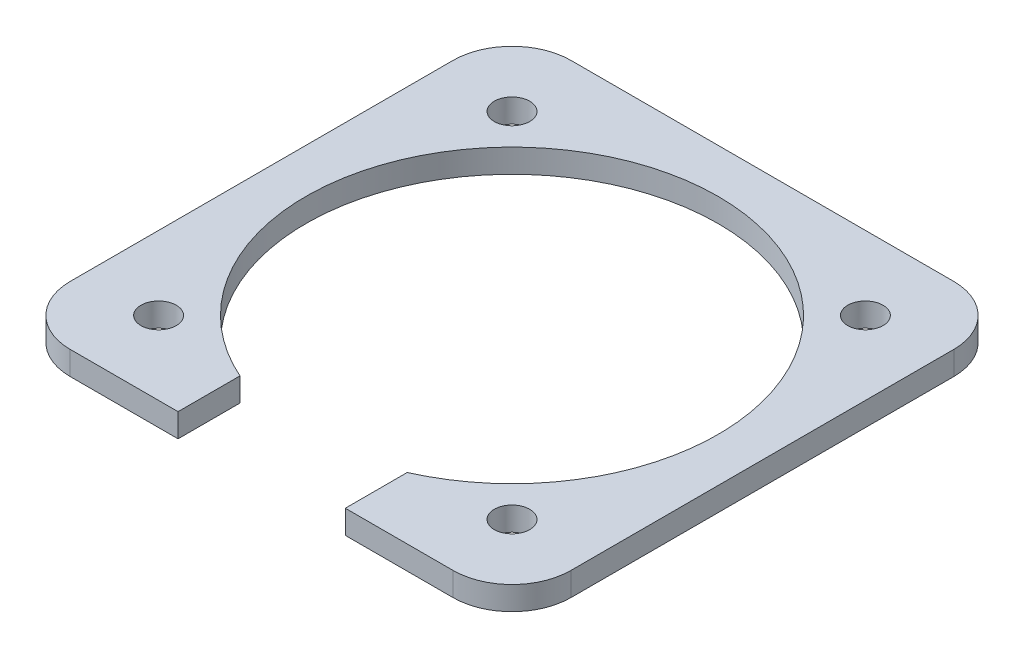
ISO-10303-21;
HEADER;
FILE_DESCRIPTION(('STEP AP214'),'2;1');
FILE_NAME('part.step','',(''),(''),'','','');
FILE_SCHEMA(('AUTOMOTIVE_DESIGN { 1 0 10303 214 1 1 1 1 }'));
ENDSEC;
DATA;
#1=APPLICATION_CONTEXT('core data for automotive mechanical design processes');
#2=APPLICATION_PROTOCOL_DEFINITION('international standard','automotive_design',2000,#1);
#3=PRODUCT_CONTEXT('',#1,'mechanical');
#4=PRODUCT('Part','Part','',(#3));
#5=PRODUCT_RELATED_PRODUCT_CATEGORY('part','',(#4));
#6=PRODUCT_DEFINITION_FORMATION('','',#4);
#7=PRODUCT_DEFINITION_CONTEXT('part definition',#1,'design');
#8=PRODUCT_DEFINITION('design','',#6,#7);
#9=PRODUCT_DEFINITION_SHAPE('','',#8);
#10=(LENGTH_UNIT() NAMED_UNIT(*) SI_UNIT(.MILLI.,.METRE.));
#11=(NAMED_UNIT(*) PLANE_ANGLE_UNIT() SI_UNIT($,.RADIAN.));
#12=(NAMED_UNIT(*) SI_UNIT($,.STERADIAN.) SOLID_ANGLE_UNIT());
#13=UNCERTAINTY_MEASURE_WITH_UNIT(LENGTH_MEASURE(1.E-05),#10,'distance_accuracy_value','');
#14=(GEOMETRIC_REPRESENTATION_CONTEXT(3) GLOBAL_UNCERTAINTY_ASSIGNED_CONTEXT((#13)) GLOBAL_UNIT_ASSIGNED_CONTEXT((#10,
#11,#12)) REPRESENTATION_CONTEXT('',''));
#15=CARTESIAN_POINT('',(0.,0.,0.));
#16=DIRECTION('',(0.,0.,1.));
#17=DIRECTION('',(1.,0.,0.));
#18=AXIS2_PLACEMENT_3D('',#15,#16,#17);
#19=CARTESIAN_POINT('',(21.25,0.,21.25));
#20=DIRECTION('',(0.,0.,1.));
#21=DIRECTION('',(1.,0.,0.));
#22=AXIS2_PLACEMENT_3D('',#19,#20,#21);
#23=PLANE('',#22);
#24=DIRECTION('',(1.,0.,0.));
#25=VECTOR('',#24,1.);
#26=CARTESIAN_POINT('',(21.25,0.,21.25));
#27=LINE('',#26,#25);
#28=CARTESIAN_POINT('',(7.1,0.,21.25));
#29=VERTEX_POINT('',#28);
#30=CARTESIAN_POINT('',(16.25,0.,21.25));
#31=VERTEX_POINT('',#30);
#32=EDGE_CURVE('E276',#29,#31,#27,.T.);
#33=ORIENTED_EDGE('',*,*,#32,.T.);
#34=DIRECTION('',(0.,1.,0.));
#35=VECTOR('',#34,1.);
#36=CARTESIAN_POINT('',(16.25,0.,21.25));
#37=LINE('',#36,#35);
#38=CARTESIAN_POINT('',(16.25,2.,21.25));
#39=VERTEX_POINT('',#38);
#40=EDGE_CURVE('E159',#31,#39,#37,.T.);
#41=ORIENTED_EDGE('',*,*,#40,.T.);
#42=DIRECTION('',(1.,0.,0.));
#43=VECTOR('',#42,1.);
#44=CARTESIAN_POINT('',(21.25,2.,21.25));
#45=LINE('',#44,#43);
#46=CARTESIAN_POINT('',(7.1,2.,21.25));
#47=VERTEX_POINT('',#46);
#48=EDGE_CURVE('E135',#47,#39,#45,.T.);
#49=ORIENTED_EDGE('',*,*,#48,.F.);
#50=DIRECTION('',(0.,1.,0.));
#51=VECTOR('',#50,1.);
#52=CARTESIAN_POINT('',(7.1,0.,21.25));
#53=LINE('',#52,#51);
#54=EDGE_CURVE('E146',#29,#47,#53,.T.);
#55=ORIENTED_EDGE('',*,*,#54,.F.);
#56=EDGE_LOOP('',(#33,#41,#49,#55));
#57=FACE_BOUND('',#56,.T.);
#58=ADVANCED_FACE('F39',(#57),#23,.T.);
#59=CARTESIAN_POINT('',(0.,2.,0.));
#60=DIRECTION('',(0.,-1.,0.));
#61=DIRECTION('',(0.,0.,-1.));
#62=AXIS2_PLACEMENT_3D('',#59,#60,#61);
#63=PLANE('',#62);
#64=CARTESIAN_POINT('',(15.,2.,15.));
#65=DIRECTION('',(0.,1.,0.));
#66=DIRECTION('',(0.,0.,1.));
#67=AXIS2_PLACEMENT_3D('',#64,#65,#66);
#68=CIRCLE('',#67,1.5);
#69=CARTESIAN_POINT('',(15.,2.,16.5));
#70=VERTEX_POINT('',#69);
#71=EDGE_CURVE('E294',#70,#70,#68,.T.);
#72=ORIENTED_EDGE('',*,*,#71,.F.);
#73=EDGE_LOOP('',(#72));
#74=FACE_BOUND('',#73,.T.);
#75=CARTESIAN_POINT('',(-15.,2.,15.));
#76=DIRECTION('',(0.,1.,0.));
#77=DIRECTION('',(0.,0.,1.));
#78=AXIS2_PLACEMENT_3D('',#75,#76,#77);
#79=CIRCLE('',#78,1.5);
#80=CARTESIAN_POINT('',(-15.,2.,16.5));
#81=VERTEX_POINT('',#80);
#82=EDGE_CURVE('E286',#81,#81,#79,.T.);
#83=ORIENTED_EDGE('',*,*,#82,.F.);
#84=EDGE_LOOP('',(#83));
#85=FACE_BOUND('',#84,.T.);
#86=CARTESIAN_POINT('',(15.,2.,-15.));
#87=DIRECTION('',(0.,1.,0.));
#88=DIRECTION('',(0.,0.,1.));
#89=AXIS2_PLACEMENT_3D('',#86,#87,#88);
#90=CIRCLE('',#89,1.5);
#91=CARTESIAN_POINT('',(15.,2.,-13.5));
#92=VERTEX_POINT('',#91);
#93=EDGE_CURVE('E285',#92,#92,#90,.T.);
#94=ORIENTED_EDGE('',*,*,#93,.F.);
#95=EDGE_LOOP('',(#94));
#96=FACE_BOUND('',#95,.T.);
#97=CARTESIAN_POINT('',(-15.,2.,-15.));
#98=DIRECTION('',(0.,1.,0.));
#99=DIRECTION('',(0.,0.,1.));
#100=AXIS2_PLACEMENT_3D('',#97,#98,#99);
#101=CIRCLE('',#100,1.5);
#102=CARTESIAN_POINT('',(-15.,2.,-13.5));
#103=VERTEX_POINT('',#102);
#104=EDGE_CURVE('E208',#103,#103,#101,.T.);
#105=ORIENTED_EDGE('',*,*,#104,.F.);
#106=EDGE_LOOP('',(#105));
#107=FACE_BOUND('',#106,.T.);
#108=DIRECTION('',(0.,0.,1.));
#109=VECTOR('',#108,1.);
#110=CARTESIAN_POINT('',(-21.25,2.,21.25));
#111=LINE('',#110,#109);
#112=CARTESIAN_POINT('',(-21.25,2.,-16.25));
#113=VERTEX_POINT('',#112);
#114=CARTESIAN_POINT('',(-21.25,2.,16.25));
#115=VERTEX_POINT('',#114);
#116=EDGE_CURVE('E162',#113,#115,#111,.T.);
#117=ORIENTED_EDGE('',*,*,#116,.T.);
#118=CARTESIAN_POINT('',(-16.25,2.,16.25));
#119=DIRECTION('',(0.,-1.,0.));
#120=DIRECTION('',(0.,0.,-1.));
#121=AXIS2_PLACEMENT_3D('',#118,#119,#120);
#122=CIRCLE('',#121,5.);
#123=CARTESIAN_POINT('',(-16.25,2.,21.25));
#124=VERTEX_POINT('',#123);
#125=EDGE_CURVE('E230',#115,#124,#122,.F.);
#126=ORIENTED_EDGE('',*,*,#125,.T.);
#127=CARTESIAN_POINT('',(-7.10000000000001,2.,21.25));
#128=VERTEX_POINT('',#127);
#129=EDGE_CURVE('E161',#124,#128,#45,.T.);
#130=ORIENTED_EDGE('',*,*,#129,.T.);
#131=DIRECTION('',(0.,0.,1.));
#132=VECTOR('',#131,1.);
#133=CARTESIAN_POINT('',(-7.1,2.,20.25));
#134=LINE('',#133,#132);
#135=CARTESIAN_POINT('',(-7.1,2.,15.9949992185058));
#136=VERTEX_POINT('',#135);
#137=EDGE_CURVE('E142',#136,#128,#134,.T.);
#138=ORIENTED_EDGE('',*,*,#137,.F.);
#139=CARTESIAN_POINT('',(0.,2.,0.));
#140=DIRECTION('',(0.,1.,0.));
#141=DIRECTION('',(0.,0.,1.));
#142=AXIS2_PLACEMENT_3D('',#139,#140,#141);
#143=CIRCLE('',#142,17.5);
#144=CARTESIAN_POINT('',(7.1,2.,15.9949992185058));
#145=VERTEX_POINT('',#144);
#146=EDGE_CURVE('E138',#145,#136,#143,.T.);
#147=ORIENTED_EDGE('',*,*,#146,.F.);
#148=DIRECTION('',(0.,0.,-1.));
#149=VECTOR('',#148,1.);
#150=CARTESIAN_POINT('',(7.1,2.,15.9949992185058));
#151=LINE('',#150,#149);
#152=EDGE_CURVE('E130',#47,#145,#151,.T.);
#153=ORIENTED_EDGE('',*,*,#152,.F.);
#154=ORIENTED_EDGE('',*,*,#48,.T.);
#155=CARTESIAN_POINT('',(16.25,2.,16.25));
#156=DIRECTION('',(0.,-1.,0.));
#157=DIRECTION('',(0.,0.,-1.));
#158=AXIS2_PLACEMENT_3D('',#155,#156,#157);
#159=CIRCLE('',#158,5.);
#160=CARTESIAN_POINT('',(21.25,2.,16.25));
#161=VERTEX_POINT('',#160);
#162=EDGE_CURVE('E227',#39,#161,#159,.F.);
#163=ORIENTED_EDGE('',*,*,#162,.T.);
#164=DIRECTION('',(0.,0.,-1.));
#165=VECTOR('',#164,1.);
#166=CARTESIAN_POINT('',(21.25,2.,21.25));
#167=LINE('',#166,#165);
#168=CARTESIAN_POINT('',(21.25,2.,-16.25));
#169=VERTEX_POINT('',#168);
#170=EDGE_CURVE('E166',#161,#169,#167,.T.);
#171=ORIENTED_EDGE('',*,*,#170,.T.);
#172=CARTESIAN_POINT('',(16.25,2.,-16.25));
#173=DIRECTION('',(0.,-1.,0.));
#174=DIRECTION('',(0.,0.,-1.));
#175=AXIS2_PLACEMENT_3D('',#172,#173,#174);
#176=CIRCLE('',#175,5.);
#177=CARTESIAN_POINT('',(16.25,2.,-21.25));
#178=VERTEX_POINT('',#177);
#179=EDGE_CURVE('E224',#169,#178,#176,.F.);
#180=ORIENTED_EDGE('',*,*,#179,.T.);
#181=DIRECTION('',(-1.,0.,0.));
#182=VECTOR('',#181,1.);
#183=CARTESIAN_POINT('',(21.25,2.,-21.25));
#184=LINE('',#183,#182);
#185=CARTESIAN_POINT('',(-16.25,2.,-21.25));
#186=VERTEX_POINT('',#185);
#187=EDGE_CURVE('E174',#178,#186,#184,.T.);
#188=ORIENTED_EDGE('',*,*,#187,.T.);
#189=CARTESIAN_POINT('',(-16.25,2.,-16.25));
#190=DIRECTION('',(0.,-1.,0.));
#191=DIRECTION('',(0.,0.,-1.));
#192=AXIS2_PLACEMENT_3D('',#189,#190,#191);
#193=CIRCLE('',#192,5.);
#194=EDGE_CURVE('E221',#186,#113,#193,.F.);
#195=ORIENTED_EDGE('',*,*,#194,.T.);
#196=EDGE_LOOP('',(#117,#126,#130,#138,#147,#153,#154,#163,#171,#180,#188,#195));
#197=FACE_BOUND('',#196,.T.);
#198=ADVANCED_FACE('F133',(#74,#85,#96,#107,#197),#63,.F.);
#199=CARTESIAN_POINT('',(0.,0.,0.));
#200=DIRECTION('',(0.,-1.,0.));
#201=DIRECTION('',(0.,0.,-1.));
#202=AXIS2_PLACEMENT_3D('',#199,#200,#201);
#203=PLANE('',#202);
#204=CARTESIAN_POINT('',(15.,0.,15.));
#205=DIRECTION('',(0.,1.,0.));
#206=DIRECTION('',(0.,0.,1.));
#207=AXIS2_PLACEMENT_3D('',#204,#205,#206);
#208=CIRCLE('',#207,1.5);
#209=CARTESIAN_POINT('',(15.,0.,16.5));
#210=VERTEX_POINT('',#209);
#211=EDGE_CURVE('E290',#210,#210,#208,.T.);
#212=ORIENTED_EDGE('',*,*,#211,.T.);
#213=EDGE_LOOP('',(#212));
#214=FACE_BOUND('',#213,.T.);
#215=CARTESIAN_POINT('',(-15.,0.,15.));
#216=DIRECTION('',(0.,-1.,0.));
#217=DIRECTION('',(0.,0.,-1.));
#218=AXIS2_PLACEMENT_3D('',#215,#216,#217);
#219=CIRCLE('',#218,1.5);
#220=CARTESIAN_POINT('',(-15.,0.,13.5));
#221=VERTEX_POINT('',#220);
#222=EDGE_CURVE('E167',#221,#221,#219,.T.);
#223=ORIENTED_EDGE('',*,*,#222,.F.);
#224=EDGE_LOOP('',(#223));
#225=FACE_BOUND('',#224,.T.);
#226=CARTESIAN_POINT('',(15.,0.,-15.));
#227=DIRECTION('',(0.,-1.,0.));
#228=DIRECTION('',(0.,0.,-1.));
#229=AXIS2_PLACEMENT_3D('',#226,#227,#228);
#230=CIRCLE('',#229,1.5);
#231=CARTESIAN_POINT('',(15.,0.,-16.5));
#232=VERTEX_POINT('',#231);
#233=EDGE_CURVE('E207',#232,#232,#230,.T.);
#234=ORIENTED_EDGE('',*,*,#233,.F.);
#235=EDGE_LOOP('',(#234));
#236=FACE_BOUND('',#235,.T.);
#237=CARTESIAN_POINT('',(-15.,0.,-15.));
#238=DIRECTION('',(0.,-1.,0.));
#239=DIRECTION('',(0.,0.,-1.));
#240=AXIS2_PLACEMENT_3D('',#237,#238,#239);
#241=CIRCLE('',#240,1.5);
#242=CARTESIAN_POINT('',(-15.,0.,-16.5));
#243=VERTEX_POINT('',#242);
#244=EDGE_CURVE('E203',#243,#243,#241,.T.);
#245=ORIENTED_EDGE('',*,*,#244,.F.);
#246=EDGE_LOOP('',(#245));
#247=FACE_BOUND('',#246,.T.);
#248=CARTESIAN_POINT('',(-16.25,0.,21.25));
#249=VERTEX_POINT('',#248);
#250=CARTESIAN_POINT('',(-7.10000000000001,0.,21.25));
#251=VERTEX_POINT('',#250);
#252=EDGE_CURVE('E272',#249,#251,#27,.T.);
#253=ORIENTED_EDGE('',*,*,#252,.F.);
#254=CARTESIAN_POINT('',(-16.25,0.,16.25));
#255=DIRECTION('',(0.,-1.,0.));
#256=DIRECTION('',(0.,0.,-1.));
#257=AXIS2_PLACEMENT_3D('',#254,#255,#256);
#258=CIRCLE('',#257,5.);
#259=CARTESIAN_POINT('',(-21.25,0.,16.25));
#260=VERTEX_POINT('',#259);
#261=EDGE_CURVE('E244',#249,#260,#258,.T.);
#262=ORIENTED_EDGE('',*,*,#261,.T.);
#263=DIRECTION('',(0.,0.,1.));
#264=VECTOR('',#263,1.);
#265=CARTESIAN_POINT('',(-21.25,0.,21.25));
#266=LINE('',#265,#264);
#267=CARTESIAN_POINT('',(-21.25,0.,-16.25));
#268=VERTEX_POINT('',#267);
#269=EDGE_CURVE('E178',#268,#260,#266,.T.);
#270=ORIENTED_EDGE('',*,*,#269,.F.);
#271=CARTESIAN_POINT('',(-16.25,0.,-16.25));
#272=DIRECTION('',(0.,-1.,0.));
#273=DIRECTION('',(0.,0.,-1.));
#274=AXIS2_PLACEMENT_3D('',#271,#272,#273);
#275=CIRCLE('',#274,5.);
#276=CARTESIAN_POINT('',(-16.25,0.,-21.25));
#277=VERTEX_POINT('',#276);
#278=EDGE_CURVE('E236',#268,#277,#275,.T.);
#279=ORIENTED_EDGE('',*,*,#278,.T.);
#280=DIRECTION('',(-1.,0.,0.));
#281=VECTOR('',#280,1.);
#282=CARTESIAN_POINT('',(21.25,0.,-21.25));
#283=LINE('',#282,#281);
#284=CARTESIAN_POINT('',(16.25,0.,-21.25));
#285=VERTEX_POINT('',#284);
#286=EDGE_CURVE('E143',#285,#277,#283,.T.);
#287=ORIENTED_EDGE('',*,*,#286,.F.);
#288=CARTESIAN_POINT('',(16.25,0.,-16.25));
#289=DIRECTION('',(0.,-1.,0.));
#290=DIRECTION('',(0.,0.,-1.));
#291=AXIS2_PLACEMENT_3D('',#288,#289,#290);
#292=CIRCLE('',#291,5.);
#293=CARTESIAN_POINT('',(21.25,0.,-16.25));
#294=VERTEX_POINT('',#293);
#295=EDGE_CURVE('E55',#285,#294,#292,.T.);
#296=ORIENTED_EDGE('',*,*,#295,.T.);
#297=DIRECTION('',(0.,0.,-1.));
#298=VECTOR('',#297,1.);
#299=CARTESIAN_POINT('',(21.25,0.,21.25));
#300=LINE('',#299,#298);
#301=CARTESIAN_POINT('',(21.25,0.,16.25));
#302=VERTEX_POINT('',#301);
#303=EDGE_CURVE('E269',#302,#294,#300,.T.);
#304=ORIENTED_EDGE('',*,*,#303,.F.);
#305=CARTESIAN_POINT('',(16.25,0.,16.25));
#306=DIRECTION('',(0.,-1.,0.));
#307=DIRECTION('',(0.,0.,-1.));
#308=AXIS2_PLACEMENT_3D('',#305,#306,#307);
#309=CIRCLE('',#308,5.);
#310=EDGE_CURVE('E241',#302,#31,#309,.T.);
#311=ORIENTED_EDGE('',*,*,#310,.T.);
#312=ORIENTED_EDGE('',*,*,#32,.F.);
#313=DIRECTION('',(0.,0.,-1.));
#314=VECTOR('',#313,1.);
#315=CARTESIAN_POINT('',(7.1,0.,15.9949992185058));
#316=LINE('',#315,#314);
#317=CARTESIAN_POINT('',(7.1,0.,15.9949992185058));
#318=VERTEX_POINT('',#317);
#319=EDGE_CURVE('E149',#29,#318,#316,.T.);
#320=ORIENTED_EDGE('',*,*,#319,.T.);
#321=CARTESIAN_POINT('',(0.,0.,0.));
#322=DIRECTION('',(0.,1.,0.));
#323=DIRECTION('',(0.,0.,1.));
#324=AXIS2_PLACEMENT_3D('',#321,#322,#323);
#325=CIRCLE('',#324,17.5);
#326=CARTESIAN_POINT('',(-7.1,0.,15.9949992185058));
#327=VERTEX_POINT('',#326);
#328=EDGE_CURVE('E192',#318,#327,#325,.T.);
#329=ORIENTED_EDGE('',*,*,#328,.T.);
#330=DIRECTION('',(0.,0.,1.));
#331=VECTOR('',#330,1.);
#332=CARTESIAN_POINT('',(-7.1,0.,20.25));
#333=LINE('',#332,#331);
#334=EDGE_CURVE('E181',#327,#251,#333,.T.);
#335=ORIENTED_EDGE('',*,*,#334,.T.);
#336=EDGE_LOOP('',(#253,#262,#270,#279,#287,#296,#304,#311,#312,#320,#329,#335));
#337=FACE_BOUND('',#336,.T.);
#338=ADVANCED_FACE('F302',(#214,#225,#236,#247,#337),#203,.T.);
#339=CARTESIAN_POINT('',(0.,2.,0.));
#340=DIRECTION('',(0.,-1.,0.));
#341=DIRECTION('',(0.,0.,-1.));
#342=AXIS2_PLACEMENT_3D('',#339,#340,#341);
#343=CYLINDRICAL_SURFACE('',#342,17.5);
#344=DIRECTION('',(0.,1.,0.));
#345=VECTOR('',#344,1.);
#346=CARTESIAN_POINT('',(-7.1,0.,15.9949992185058));
#347=LINE('',#346,#345);
#348=EDGE_CURVE('E189',#327,#136,#347,.T.);
#349=ORIENTED_EDGE('',*,*,#348,.F.);
#350=ORIENTED_EDGE('',*,*,#328,.F.);
#351=DIRECTION('',(0.,1.,0.));
#352=VECTOR('',#351,1.);
#353=CARTESIAN_POINT('',(7.1,0.,15.9949992185058));
#354=LINE('',#353,#352);
#355=EDGE_CURVE('E184',#318,#145,#354,.T.);
#356=ORIENTED_EDGE('',*,*,#355,.T.);
#357=ORIENTED_EDGE('',*,*,#146,.T.);
#358=EDGE_LOOP('',(#349,#350,#356,#357));
#359=FACE_BOUND('',#358,.T.);
#360=ADVANCED_FACE('F353',(#359),#343,.F.);
#361=CARTESIAN_POINT('',(7.1,0.,15.9949992185058));
#362=DIRECTION('',(1.,0.,0.));
#363=DIRECTION('',(0.,0.,-1.));
#364=AXIS2_PLACEMENT_3D('',#361,#362,#363);
#365=PLANE('',#364);
#366=ORIENTED_EDGE('',*,*,#152,.T.);
#367=ORIENTED_EDGE('',*,*,#355,.F.);
#368=ORIENTED_EDGE('',*,*,#319,.F.);
#369=ORIENTED_EDGE('',*,*,#54,.T.);
#370=EDGE_LOOP('',(#366,#367,#368,#369));
#371=FACE_BOUND('',#370,.T.);
#372=ADVANCED_FACE('F147',(#371),#365,.F.);
#373=CARTESIAN_POINT('',(-7.1,0.,20.25));
#374=DIRECTION('',(-1.,0.,0.));
#375=DIRECTION('',(0.,0.,1.));
#376=AXIS2_PLACEMENT_3D('',#373,#374,#375);
#377=PLANE('',#376);
#378=ORIENTED_EDGE('',*,*,#137,.T.);
#379=DIRECTION('',(0.,-1.,0.));
#380=VECTOR('',#379,1.);
#381=CARTESIAN_POINT('',(-7.10000000000001,0.,21.25));
#382=LINE('',#381,#380);
#383=EDGE_CURVE('E155',#128,#251,#382,.T.);
#384=ORIENTED_EDGE('',*,*,#383,.T.);
#385=ORIENTED_EDGE('',*,*,#334,.F.);
#386=ORIENTED_EDGE('',*,*,#348,.T.);
#387=EDGE_LOOP('',(#378,#384,#385,#386));
#388=FACE_BOUND('',#387,.T.);
#389=ADVANCED_FACE('F346',(#388),#377,.F.);
#390=CARTESIAN_POINT('',(-21.25,0.,21.25));
#391=DIRECTION('',(-1.,0.,0.));
#392=DIRECTION('',(0.,0.,1.));
#393=AXIS2_PLACEMENT_3D('',#390,#391,#392);
#394=PLANE('',#393);
#395=ORIENTED_EDGE('',*,*,#269,.T.);
#396=DIRECTION('',(0.,1.,0.));
#397=VECTOR('',#396,1.);
#398=CARTESIAN_POINT('',(-21.25,0.,16.25));
#399=LINE('',#398,#397);
#400=EDGE_CURVE('E217',#260,#115,#399,.T.);
#401=ORIENTED_EDGE('',*,*,#400,.T.);
#402=ORIENTED_EDGE('',*,*,#116,.F.);
#403=DIRECTION('',(0.,1.,0.));
#404=VECTOR('',#403,1.);
#405=CARTESIAN_POINT('',(-21.25,0.,-16.25));
#406=LINE('',#405,#404);
#407=EDGE_CURVE('E154',#113,#268,#406,.F.);
#408=ORIENTED_EDGE('',*,*,#407,.T.);
#409=EDGE_LOOP('',(#395,#401,#402,#408));
#410=FACE_BOUND('',#409,.T.);
#411=ADVANCED_FACE('F343',(#410),#394,.T.);
#412=CARTESIAN_POINT('',(21.25,0.,-21.25));
#413=DIRECTION('',(0.,0.,-1.));
#414=DIRECTION('',(-1.,0.,0.));
#415=AXIS2_PLACEMENT_3D('',#412,#413,#414);
#416=PLANE('',#415);
#417=ORIENTED_EDGE('',*,*,#187,.F.);
#418=DIRECTION('',(0.,1.,0.));
#419=VECTOR('',#418,1.);
#420=CARTESIAN_POINT('',(16.25,0.,-21.25));
#421=LINE('',#420,#419);
#422=EDGE_CURVE('E11',#178,#285,#421,.F.);
#423=ORIENTED_EDGE('',*,*,#422,.T.);
#424=ORIENTED_EDGE('',*,*,#286,.T.);
#425=DIRECTION('',(0.,1.,0.));
#426=VECTOR('',#425,1.);
#427=CARTESIAN_POINT('',(-16.25,0.,-21.25));
#428=LINE('',#427,#426);
#429=EDGE_CURVE('E48',#277,#186,#428,.T.);
#430=ORIENTED_EDGE('',*,*,#429,.T.);
#431=EDGE_LOOP('',(#417,#423,#424,#430));
#432=FACE_BOUND('',#431,.T.);
#433=ADVANCED_FACE('F260',(#432),#416,.T.);
#434=CARTESIAN_POINT('',(21.25,0.,21.25));
#435=DIRECTION('',(1.,0.,0.));
#436=DIRECTION('',(0.,0.,-1.));
#437=AXIS2_PLACEMENT_3D('',#434,#435,#436);
#438=PLANE('',#437);
#439=ORIENTED_EDGE('',*,*,#170,.F.);
#440=DIRECTION('',(0.,1.,0.));
#441=VECTOR('',#440,1.);
#442=CARTESIAN_POINT('',(21.25,0.,16.25));
#443=LINE('',#442,#441);
#444=EDGE_CURVE('E62',#161,#302,#443,.F.);
#445=ORIENTED_EDGE('',*,*,#444,.T.);
#446=ORIENTED_EDGE('',*,*,#303,.T.);
#447=DIRECTION('',(0.,1.,0.));
#448=VECTOR('',#447,1.);
#449=CARTESIAN_POINT('',(21.25,0.,-16.25));
#450=LINE('',#449,#448);
#451=EDGE_CURVE('E249',#294,#169,#450,.T.);
#452=ORIENTED_EDGE('',*,*,#451,.T.);
#453=EDGE_LOOP('',(#439,#445,#446,#452));
#454=FACE_BOUND('',#453,.T.);
#455=ADVANCED_FACE('F268',(#454),#438,.T.);
#456=ORIENTED_EDGE('',*,*,#129,.F.);
#457=DIRECTION('',(0.,1.,0.));
#458=VECTOR('',#457,1.);
#459=CARTESIAN_POINT('',(-16.25,0.,21.25));
#460=LINE('',#459,#458);
#461=EDGE_CURVE('E233',#124,#249,#460,.F.);
#462=ORIENTED_EDGE('',*,*,#461,.T.);
#463=ORIENTED_EDGE('',*,*,#252,.T.);
#464=ORIENTED_EDGE('',*,*,#383,.F.);
#465=EDGE_LOOP('',(#456,#462,#463,#464));
#466=FACE_BOUND('',#465,.T.);
#467=ADVANCED_FACE('F325',(#466),#23,.T.);
#468=CARTESIAN_POINT('',(-15.,-1.5,-15.));
#469=DIRECTION('',(0.,1.,0.));
#470=DIRECTION('',(0.,0.,1.));
#471=AXIS2_PLACEMENT_3D('',#468,#469,#470);
#472=CYLINDRICAL_SURFACE('',#471,1.5);
#473=ORIENTED_EDGE('',*,*,#244,.T.);
#474=EDGE_LOOP('',(#473));
#475=FACE_BOUND('',#474,.T.);
#476=ORIENTED_EDGE('',*,*,#104,.T.);
#477=EDGE_LOOP('',(#476));
#478=FACE_BOUND('',#477,.T.);
#479=ADVANCED_FACE('F322',(#475,#478),#472,.F.);
#480=CARTESIAN_POINT('',(15.,-1.5,-15.));
#481=DIRECTION('',(0.,1.,0.));
#482=DIRECTION('',(0.,0.,1.));
#483=AXIS2_PLACEMENT_3D('',#480,#481,#482);
#484=CYLINDRICAL_SURFACE('',#483,1.5);
#485=ORIENTED_EDGE('',*,*,#233,.T.);
#486=EDGE_LOOP('',(#485));
#487=FACE_BOUND('',#486,.T.);
#488=ORIENTED_EDGE('',*,*,#93,.T.);
#489=EDGE_LOOP('',(#488));
#490=FACE_BOUND('',#489,.T.);
#491=ADVANCED_FACE('F324',(#487,#490),#484,.F.);
#492=CARTESIAN_POINT('',(-15.,-1.5,15.));
#493=DIRECTION('',(0.,1.,0.));
#494=DIRECTION('',(0.,0.,1.));
#495=AXIS2_PLACEMENT_3D('',#492,#493,#494);
#496=CYLINDRICAL_SURFACE('',#495,1.5);
#497=ORIENTED_EDGE('',*,*,#222,.T.);
#498=EDGE_LOOP('',(#497));
#499=FACE_BOUND('',#498,.T.);
#500=ORIENTED_EDGE('',*,*,#82,.T.);
#501=EDGE_LOOP('',(#500));
#502=FACE_BOUND('',#501,.T.);
#503=ADVANCED_FACE('F309',(#499,#502),#496,.F.);
#504=CARTESIAN_POINT('',(15.,0.,15.));
#505=DIRECTION('',(0.,1.,0.));
#506=DIRECTION('',(0.,0.,1.));
#507=AXIS2_PLACEMENT_3D('',#504,#505,#506);
#508=CYLINDRICAL_SURFACE('',#507,1.5);
#509=ORIENTED_EDGE('',*,*,#211,.F.);
#510=EDGE_LOOP('',(#509));
#511=FACE_BOUND('',#510,.T.);
#512=ORIENTED_EDGE('',*,*,#71,.T.);
#513=EDGE_LOOP('',(#512));
#514=FACE_BOUND('',#513,.T.);
#515=ADVANCED_FACE('F305',(#511,#514),#508,.F.);
#516=CARTESIAN_POINT('',(-16.25,0.,16.25));
#517=DIRECTION('',(0.,1.,0.));
#518=DIRECTION('',(0.,0.,1.));
#519=AXIS2_PLACEMENT_3D('',#516,#517,#518);
#520=CYLINDRICAL_SURFACE('',#519,5.);
#521=ORIENTED_EDGE('',*,*,#261,.F.);
#522=ORIENTED_EDGE('',*,*,#461,.F.);
#523=ORIENTED_EDGE('',*,*,#125,.F.);
#524=ORIENTED_EDGE('',*,*,#400,.F.);
#525=EDGE_LOOP('',(#521,#522,#523,#524));
#526=FACE_BOUND('',#525,.T.);
#527=ADVANCED_FACE('F308',(#526),#520,.T.);
#528=CARTESIAN_POINT('',(16.25,0.,16.25));
#529=DIRECTION('',(0.,1.,0.));
#530=DIRECTION('',(0.,0.,1.));
#531=AXIS2_PLACEMENT_3D('',#528,#529,#530);
#532=CYLINDRICAL_SURFACE('',#531,5.);
#533=ORIENTED_EDGE('',*,*,#310,.F.);
#534=ORIENTED_EDGE('',*,*,#444,.F.);
#535=ORIENTED_EDGE('',*,*,#162,.F.);
#536=ORIENTED_EDGE('',*,*,#40,.F.);
#537=EDGE_LOOP('',(#533,#534,#535,#536));
#538=FACE_BOUND('',#537,.T.);
#539=ADVANCED_FACE('F361',(#538),#532,.T.);
#540=CARTESIAN_POINT('',(16.25,0.,-16.25));
#541=DIRECTION('',(0.,1.,0.));
#542=DIRECTION('',(0.,0.,1.));
#543=AXIS2_PLACEMENT_3D('',#540,#541,#542);
#544=CYLINDRICAL_SURFACE('',#543,5.);
#545=ORIENTED_EDGE('',*,*,#295,.F.);
#546=ORIENTED_EDGE('',*,*,#422,.F.);
#547=ORIENTED_EDGE('',*,*,#179,.F.);
#548=ORIENTED_EDGE('',*,*,#451,.F.);
#549=EDGE_LOOP('',(#545,#546,#547,#548));
#550=FACE_BOUND('',#549,.T.);
#551=ADVANCED_FACE('F267',(#550),#544,.T.);
#552=CARTESIAN_POINT('',(-16.25,0.,-16.25));
#553=DIRECTION('',(0.,1.,0.));
#554=DIRECTION('',(0.,0.,1.));
#555=AXIS2_PLACEMENT_3D('',#552,#553,#554);
#556=CYLINDRICAL_SURFACE('',#555,5.);
#557=ORIENTED_EDGE('',*,*,#278,.F.);
#558=ORIENTED_EDGE('',*,*,#407,.F.);
#559=ORIENTED_EDGE('',*,*,#194,.F.);
#560=ORIENTED_EDGE('',*,*,#429,.F.);
#561=EDGE_LOOP('',(#557,#558,#559,#560));
#562=FACE_BOUND('',#561,.T.);
#563=ADVANCED_FACE('F41',(#562),#556,.T.);
#564=CLOSED_SHELL('',(#58,#198,#338,#360,#372,#389,#411,#433,#455,#467,#479,#491,#503,#515,#527,
#539,#551,#563));
#565=MANIFOLD_SOLID_BREP('B2',#564);
#566=ADVANCED_BREP_SHAPE_REPRESENTATION('',(#18,#565),#14);
#567=SHAPE_DEFINITION_REPRESENTATION(#9,#566);
ENDSEC;
END-ISO-10303-21;
